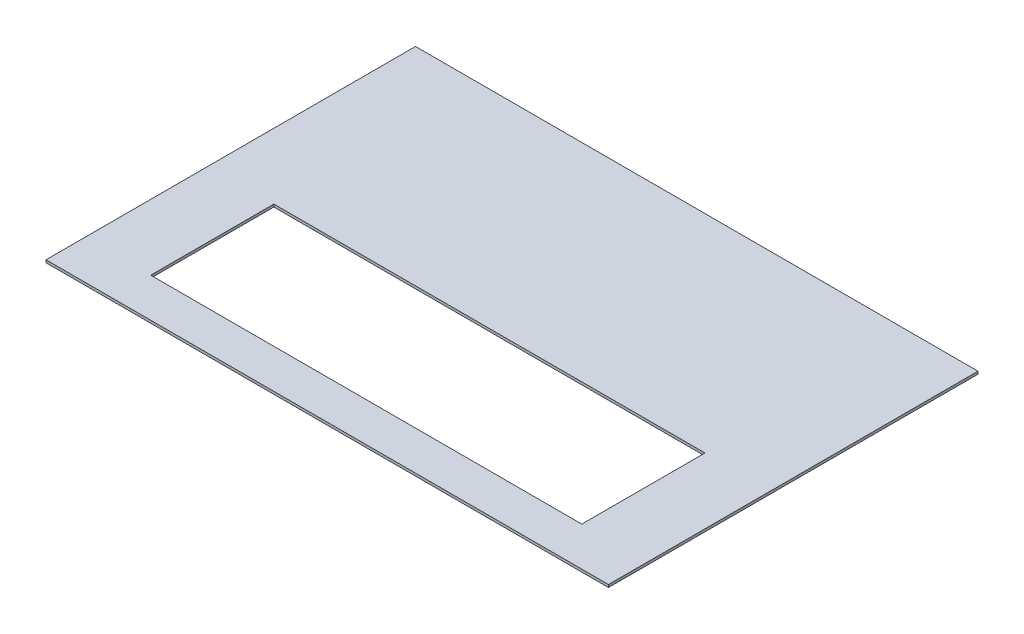
ISO-10303-21;
HEADER;
FILE_DESCRIPTION(('STEP AP214'),'2;1');
FILE_NAME('part.step','',(''),(''),'','','');
FILE_SCHEMA(('AUTOMOTIVE_DESIGN { 1 0 10303 214 1 1 1 1 }'));
ENDSEC;
DATA;
#1=APPLICATION_CONTEXT('core data for automotive mechanical design processes');
#2=APPLICATION_PROTOCOL_DEFINITION('international standard','automotive_design',2000,#1);
#3=PRODUCT_CONTEXT('',#1,'mechanical');
#4=PRODUCT('Part','Part','',(#3));
#5=PRODUCT_RELATED_PRODUCT_CATEGORY('part','',(#4));
#6=PRODUCT_DEFINITION_FORMATION('','',#4);
#7=PRODUCT_DEFINITION_CONTEXT('part definition',#1,'design');
#8=PRODUCT_DEFINITION('design','',#6,#7);
#9=PRODUCT_DEFINITION_SHAPE('','',#8);
#10=(LENGTH_UNIT() NAMED_UNIT(*) SI_UNIT(.MILLI.,.METRE.));
#11=(NAMED_UNIT(*) PLANE_ANGLE_UNIT() SI_UNIT($,.RADIAN.));
#12=(NAMED_UNIT(*) SI_UNIT($,.STERADIAN.) SOLID_ANGLE_UNIT());
#13=UNCERTAINTY_MEASURE_WITH_UNIT(LENGTH_MEASURE(1.E-05),#10,'distance_accuracy_value','');
#14=(GEOMETRIC_REPRESENTATION_CONTEXT(3) GLOBAL_UNCERTAINTY_ASSIGNED_CONTEXT((#13)) GLOBAL_UNIT_ASSIGNED_CONTEXT((#10,
#11,#12)) REPRESENTATION_CONTEXT('',''));
#15=CARTESIAN_POINT('',(0.,0.,0.));
#16=DIRECTION('',(0.,0.,1.));
#17=DIRECTION('',(1.,0.,0.));
#18=AXIS2_PLACEMENT_3D('',#15,#16,#17);
#19=CARTESIAN_POINT('',(0.,6.35,0.));
#20=DIRECTION('',(1.,0.,0.));
#21=DIRECTION('',(0.,0.,-1.));
#22=AXIS2_PLACEMENT_3D('',#19,#20,#21);
#23=PLANE('',#22);
#24=DIRECTION('',(0.,0.,1.));
#25=VECTOR('',#24,1.);
#26=CARTESIAN_POINT('',(0.,0.,0.));
#27=LINE('',#26,#25);
#28=CARTESIAN_POINT('',(0.,0.,-900.));
#29=VERTEX_POINT('',#28);
#30=CARTESIAN_POINT('',(0.,0.,0.));
#31=VERTEX_POINT('',#30);
#32=EDGE_CURVE('E115',#29,#31,#27,.T.);
#33=ORIENTED_EDGE('',*,*,#32,.T.);
#34=DIRECTION('',(0.,-1.,0.));
#35=VECTOR('',#34,1.);
#36=CARTESIAN_POINT('',(0.,6.35,0.));
#37=LINE('',#36,#35);
#38=CARTESIAN_POINT('',(0.,6.35,0.));
#39=VERTEX_POINT('',#38);
#40=EDGE_CURVE('E11',#39,#31,#37,.T.);
#41=ORIENTED_EDGE('',*,*,#40,.F.);
#42=DIRECTION('',(0.,0.,1.));
#43=VECTOR('',#42,1.);
#44=CARTESIAN_POINT('',(0.,6.35,0.));
#45=LINE('',#44,#43);
#46=CARTESIAN_POINT('',(0.,6.35,-900.));
#47=VERTEX_POINT('',#46);
#48=EDGE_CURVE('E154',#47,#39,#45,.T.);
#49=ORIENTED_EDGE('',*,*,#48,.F.);
#50=DIRECTION('',(0.,-1.,0.));
#51=VECTOR('',#50,1.);
#52=CARTESIAN_POINT('',(0.,6.35,-900.));
#53=LINE('',#52,#51);
#54=EDGE_CURVE('E168',#47,#29,#53,.T.);
#55=ORIENTED_EDGE('',*,*,#54,.T.);
#56=EDGE_LOOP('',(#33,#41,#49,#55));
#57=FACE_BOUND('',#56,.T.);
#58=ADVANCED_FACE('F43',(#57),#23,.F.);
#59=CARTESIAN_POINT('',(0.,6.35,0.));
#60=DIRECTION('',(0.,0.,-1.));
#61=DIRECTION('',(-1.,0.,0.));
#62=AXIS2_PLACEMENT_3D('',#59,#60,#61);
#63=PLANE('',#62);
#64=DIRECTION('',(1.,0.,0.));
#65=VECTOR('',#64,1.);
#66=CARTESIAN_POINT('',(0.,0.,0.));
#67=LINE('',#66,#65);
#68=CARTESIAN_POINT('',(1370.,0.,0.));
#69=VERTEX_POINT('',#68);
#70=EDGE_CURVE('E172',#31,#69,#67,.T.);
#71=ORIENTED_EDGE('',*,*,#70,.T.);
#72=DIRECTION('',(0.,-1.,0.));
#73=VECTOR('',#72,1.);
#74=CARTESIAN_POINT('',(1370.,6.35,0.));
#75=LINE('',#74,#73);
#76=CARTESIAN_POINT('',(1370.,6.35,0.));
#77=VERTEX_POINT('',#76);
#78=EDGE_CURVE('E51',#77,#69,#75,.T.);
#79=ORIENTED_EDGE('',*,*,#78,.F.);
#80=DIRECTION('',(1.,0.,0.));
#81=VECTOR('',#80,1.);
#82=CARTESIAN_POINT('',(0.,6.35,0.));
#83=LINE('',#82,#81);
#84=EDGE_CURVE('E158',#39,#77,#83,.T.);
#85=ORIENTED_EDGE('',*,*,#84,.F.);
#86=ORIENTED_EDGE('',*,*,#40,.T.);
#87=EDGE_LOOP('',(#71,#79,#85,#86));
#88=FACE_BOUND('',#87,.T.);
#89=ADVANCED_FACE('F206',(#88),#63,.F.);
#90=CARTESIAN_POINT('',(1370.,6.35,0.));
#91=DIRECTION('',(-1.,0.,0.));
#92=DIRECTION('',(0.,0.,1.));
#93=AXIS2_PLACEMENT_3D('',#90,#91,#92);
#94=PLANE('',#93);
#95=DIRECTION('',(0.,0.,-1.));
#96=VECTOR('',#95,1.);
#97=CARTESIAN_POINT('',(1370.,0.,0.));
#98=LINE('',#97,#96);
#99=CARTESIAN_POINT('',(1370.,0.,-900.));
#100=VERTEX_POINT('',#99);
#101=EDGE_CURVE('E175',#69,#100,#98,.T.);
#102=ORIENTED_EDGE('',*,*,#101,.T.);
#103=DIRECTION('',(0.,-1.,0.));
#104=VECTOR('',#103,1.);
#105=CARTESIAN_POINT('',(1370.,6.35,-900.));
#106=LINE('',#105,#104);
#107=CARTESIAN_POINT('',(1370.,6.35,-900.));
#108=VERTEX_POINT('',#107);
#109=EDGE_CURVE('E183',#108,#100,#106,.T.);
#110=ORIENTED_EDGE('',*,*,#109,.F.);
#111=DIRECTION('',(0.,0.,-1.));
#112=VECTOR('',#111,1.);
#113=CARTESIAN_POINT('',(1370.,6.35,0.));
#114=LINE('',#113,#112);
#115=EDGE_CURVE('E162',#77,#108,#114,.T.);
#116=ORIENTED_EDGE('',*,*,#115,.F.);
#117=ORIENTED_EDGE('',*,*,#78,.T.);
#118=EDGE_LOOP('',(#102,#110,#116,#117));
#119=FACE_BOUND('',#118,.T.);
#120=ADVANCED_FACE('F192',(#119),#94,.F.);
#121=CARTESIAN_POINT('',(0.,6.35,-900.));
#122=DIRECTION('',(0.,0.,1.));
#123=DIRECTION('',(1.,0.,0.));
#124=AXIS2_PLACEMENT_3D('',#121,#122,#123);
#125=PLANE('',#124);
#126=DIRECTION('',(-1.,0.,0.));
#127=VECTOR('',#126,1.);
#128=CARTESIAN_POINT('',(0.,0.,-900.));
#129=LINE('',#128,#127);
#130=EDGE_CURVE('E159',#100,#29,#129,.T.);
#131=ORIENTED_EDGE('',*,*,#130,.T.);
#132=ORIENTED_EDGE('',*,*,#54,.F.);
#133=DIRECTION('',(-1.,0.,0.));
#134=VECTOR('',#133,1.);
#135=CARTESIAN_POINT('',(0.,6.35,-900.));
#136=LINE('',#135,#134);
#137=EDGE_CURVE('E165',#108,#47,#136,.T.);
#138=ORIENTED_EDGE('',*,*,#137,.F.);
#139=ORIENTED_EDGE('',*,*,#109,.T.);
#140=EDGE_LOOP('',(#131,#132,#138,#139));
#141=FACE_BOUND('',#140,.T.);
#142=ADVANCED_FACE('F199',(#141),#125,.F.);
#143=CARTESIAN_POINT('',(0.,6.35,0.));
#144=DIRECTION('',(0.,-1.,0.));
#145=DIRECTION('',(0.,0.,-1.));
#146=AXIS2_PLACEMENT_3D('',#143,#144,#145);
#147=PLANE('',#146);
#148=DIRECTION('',(1.,0.,0.));
#149=VECTOR('',#148,1.);
#150=CARTESIAN_POINT('',(160.,6.35,-95.));
#151=LINE('',#150,#149);
#152=CARTESIAN_POINT('',(160.,6.35,-95.));
#153=VERTEX_POINT('',#152);
#154=CARTESIAN_POINT('',(1210.,6.35,-95.));
#155=VERTEX_POINT('',#154);
#156=EDGE_CURVE('E132',#153,#155,#151,.T.);
#157=ORIENTED_EDGE('',*,*,#156,.F.);
#158=DIRECTION('',(0.,0.,1.));
#159=VECTOR('',#158,1.);
#160=CARTESIAN_POINT('',(160.,6.35,-95.));
#161=LINE('',#160,#159);
#162=CARTESIAN_POINT('',(160.,6.35,-395.));
#163=VERTEX_POINT('',#162);
#164=EDGE_CURVE('E58',#163,#153,#161,.T.);
#165=ORIENTED_EDGE('',*,*,#164,.F.);
#166=DIRECTION('',(-1.,0.,0.));
#167=VECTOR('',#166,1.);
#168=CARTESIAN_POINT('',(160.,6.35,-395.));
#169=LINE('',#168,#167);
#170=CARTESIAN_POINT('',(1210.,6.35,-395.));
#171=VERTEX_POINT('',#170);
#172=EDGE_CURVE('E122',#171,#163,#169,.T.);
#173=ORIENTED_EDGE('',*,*,#172,.F.);
#174=DIRECTION('',(0.,0.,-1.));
#175=VECTOR('',#174,1.);
#176=CARTESIAN_POINT('',(1210.,6.35,-95.));
#177=LINE('',#176,#175);
#178=EDGE_CURVE('E140',#155,#171,#177,.T.);
#179=ORIENTED_EDGE('',*,*,#178,.F.);
#180=EDGE_LOOP('',(#157,#165,#173,#179));
#181=FACE_BOUND('',#180,.T.);
#182=ORIENTED_EDGE('',*,*,#48,.T.);
#183=ORIENTED_EDGE('',*,*,#84,.T.);
#184=ORIENTED_EDGE('',*,*,#115,.T.);
#185=ORIENTED_EDGE('',*,*,#137,.T.);
#186=EDGE_LOOP('',(#182,#183,#184,#185));
#187=FACE_BOUND('',#186,.T.);
#188=ADVANCED_FACE('F205',(#181,#187),#147,.F.);
#189=CARTESIAN_POINT('',(0.,0.,0.));
#190=DIRECTION('',(0.,-1.,0.));
#191=DIRECTION('',(0.,0.,-1.));
#192=AXIS2_PLACEMENT_3D('',#189,#190,#191);
#193=PLANE('',#192);
#194=DIRECTION('',(0.,0.,1.));
#195=VECTOR('',#194,1.);
#196=CARTESIAN_POINT('',(160.,0.,-95.));
#197=LINE('',#196,#195);
#198=CARTESIAN_POINT('',(160.,0.,-395.));
#199=VERTEX_POINT('',#198);
#200=CARTESIAN_POINT('',(160.,0.,-95.));
#201=VERTEX_POINT('',#200);
#202=EDGE_CURVE('E119',#199,#201,#197,.T.);
#203=ORIENTED_EDGE('',*,*,#202,.T.);
#204=DIRECTION('',(1.,0.,0.));
#205=VECTOR('',#204,1.);
#206=CARTESIAN_POINT('',(160.,0.,-95.));
#207=LINE('',#206,#205);
#208=CARTESIAN_POINT('',(1210.,0.,-95.));
#209=VERTEX_POINT('',#208);
#210=EDGE_CURVE('E107',#201,#209,#207,.T.);
#211=ORIENTED_EDGE('',*,*,#210,.T.);
#212=DIRECTION('',(0.,0.,-1.));
#213=VECTOR('',#212,1.);
#214=CARTESIAN_POINT('',(1210.,0.,-95.));
#215=LINE('',#214,#213);
#216=CARTESIAN_POINT('',(1210.,0.,-395.));
#217=VERTEX_POINT('',#216);
#218=EDGE_CURVE('E134',#209,#217,#215,.T.);
#219=ORIENTED_EDGE('',*,*,#218,.T.);
#220=DIRECTION('',(-1.,0.,0.));
#221=VECTOR('',#220,1.);
#222=CARTESIAN_POINT('',(160.,0.,-395.));
#223=LINE('',#222,#221);
#224=EDGE_CURVE('E127',#217,#199,#223,.T.);
#225=ORIENTED_EDGE('',*,*,#224,.T.);
#226=EDGE_LOOP('',(#203,#211,#219,#225));
#227=FACE_BOUND('',#226,.T.);
#228=ORIENTED_EDGE('',*,*,#32,.F.);
#229=ORIENTED_EDGE('',*,*,#130,.F.);
#230=ORIENTED_EDGE('',*,*,#101,.F.);
#231=ORIENTED_EDGE('',*,*,#70,.F.);
#232=EDGE_LOOP('',(#228,#229,#230,#231));
#233=FACE_BOUND('',#232,.T.);
#234=ADVANCED_FACE('F125',(#227,#233),#193,.T.);
#235=CARTESIAN_POINT('',(160.,-0.00100000000000013,-95.));
#236=DIRECTION('',(-1.,0.,0.));
#237=DIRECTION('',(0.,0.,1.));
#238=AXIS2_PLACEMENT_3D('',#235,#236,#237);
#239=PLANE('',#238);
#240=DIRECTION('',(0.,1.,0.));
#241=VECTOR('',#240,1.);
#242=CARTESIAN_POINT('',(160.,-0.00100000000000013,-395.));
#243=LINE('',#242,#241);
#244=EDGE_CURVE('E116',#199,#163,#243,.T.);
#245=ORIENTED_EDGE('',*,*,#244,.T.);
#246=ORIENTED_EDGE('',*,*,#164,.T.);
#247=DIRECTION('',(0.,1.,0.));
#248=VECTOR('',#247,1.);
#249=CARTESIAN_POINT('',(160.,-0.00100000000000013,-95.));
#250=LINE('',#249,#248);
#251=EDGE_CURVE('E109',#201,#153,#250,.T.);
#252=ORIENTED_EDGE('',*,*,#251,.F.);
#253=ORIENTED_EDGE('',*,*,#202,.F.);
#254=EDGE_LOOP('',(#245,#246,#252,#253));
#255=FACE_BOUND('',#254,.T.);
#256=ADVANCED_FACE('F118',(#255),#239,.F.);
#257=CARTESIAN_POINT('',(160.,-0.00100000000000013,-395.));
#258=DIRECTION('',(0.,0.,-1.));
#259=DIRECTION('',(-1.,0.,0.));
#260=AXIS2_PLACEMENT_3D('',#257,#258,#259);
#261=PLANE('',#260);
#262=DIRECTION('',(0.,1.,0.));
#263=VECTOR('',#262,1.);
#264=CARTESIAN_POINT('',(1210.,-0.00100000000000013,-395.));
#265=LINE('',#264,#263);
#266=EDGE_CURVE('E149',#217,#171,#265,.T.);
#267=ORIENTED_EDGE('',*,*,#266,.T.);
#268=ORIENTED_EDGE('',*,*,#172,.T.);
#269=ORIENTED_EDGE('',*,*,#244,.F.);
#270=ORIENTED_EDGE('',*,*,#224,.F.);
#271=EDGE_LOOP('',(#267,#268,#269,#270));
#272=FACE_BOUND('',#271,.T.);
#273=ADVANCED_FACE('F223',(#272),#261,.F.);
#274=CARTESIAN_POINT('',(1210.,-0.00100000000000013,-95.));
#275=DIRECTION('',(1.,0.,0.));
#276=DIRECTION('',(0.,0.,-1.));
#277=AXIS2_PLACEMENT_3D('',#274,#275,#276);
#278=PLANE('',#277);
#279=DIRECTION('',(0.,1.,0.));
#280=VECTOR('',#279,1.);
#281=CARTESIAN_POINT('',(1210.,-0.00100000000000013,-95.));
#282=LINE('',#281,#280);
#283=EDGE_CURVE('E66',#209,#155,#282,.T.);
#284=ORIENTED_EDGE('',*,*,#283,.T.);
#285=ORIENTED_EDGE('',*,*,#178,.T.);
#286=ORIENTED_EDGE('',*,*,#266,.F.);
#287=ORIENTED_EDGE('',*,*,#218,.F.);
#288=EDGE_LOOP('',(#284,#285,#286,#287));
#289=FACE_BOUND('',#288,.T.);
#290=ADVANCED_FACE('F226',(#289),#278,.F.);
#291=CARTESIAN_POINT('',(160.,-0.00100000000000013,-95.));
#292=DIRECTION('',(0.,0.,1.));
#293=DIRECTION('',(1.,0.,0.));
#294=AXIS2_PLACEMENT_3D('',#291,#292,#293);
#295=PLANE('',#294);
#296=ORIENTED_EDGE('',*,*,#251,.T.);
#297=ORIENTED_EDGE('',*,*,#156,.T.);
#298=ORIENTED_EDGE('',*,*,#283,.F.);
#299=ORIENTED_EDGE('',*,*,#210,.F.);
#300=EDGE_LOOP('',(#296,#297,#298,#299));
#301=FACE_BOUND('',#300,.T.);
#302=ADVANCED_FACE('F108',(#301),#295,.F.);
#303=CLOSED_SHELL('',(#58,#89,#120,#142,#188,#234,#256,#273,#290,#302));
#304=MANIFOLD_SOLID_BREP('B2',#303);
#305=ADVANCED_BREP_SHAPE_REPRESENTATION('',(#18,#304),#14);
#306=SHAPE_DEFINITION_REPRESENTATION(#9,#305);
ENDSEC;
END-ISO-10303-21;
